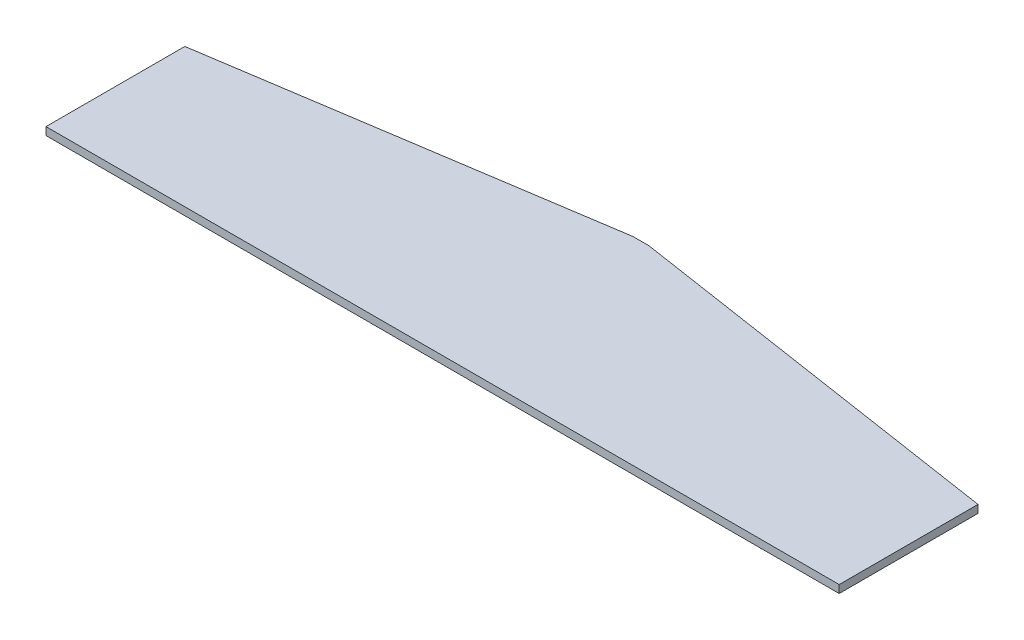
ISO-10303-21;
HEADER;
FILE_DESCRIPTION(('STEP AP214'),'2;1');
FILE_NAME('part.step','',(''),(''),'','','');
FILE_SCHEMA(('AUTOMOTIVE_DESIGN { 1 0 10303 214 1 1 1 1 }'));
ENDSEC;
DATA;
#1=APPLICATION_CONTEXT('core data for automotive mechanical design processes');
#2=APPLICATION_PROTOCOL_DEFINITION('international standard','automotive_design',2000,#1);
#3=PRODUCT_CONTEXT('',#1,'mechanical');
#4=PRODUCT('Part','Part','',(#3));
#5=PRODUCT_RELATED_PRODUCT_CATEGORY('part','',(#4));
#6=PRODUCT_DEFINITION_FORMATION('','',#4);
#7=PRODUCT_DEFINITION_CONTEXT('part definition',#1,'design');
#8=PRODUCT_DEFINITION('design','',#6,#7);
#9=PRODUCT_DEFINITION_SHAPE('','',#8);
#10=(LENGTH_UNIT() NAMED_UNIT(*) SI_UNIT(.MILLI.,.METRE.));
#11=(NAMED_UNIT(*) PLANE_ANGLE_UNIT() SI_UNIT($,.RADIAN.));
#12=(NAMED_UNIT(*) SI_UNIT($,.STERADIAN.) SOLID_ANGLE_UNIT());
#13=UNCERTAINTY_MEASURE_WITH_UNIT(LENGTH_MEASURE(1.E-05),#10,'distance_accuracy_value','');
#14=(GEOMETRIC_REPRESENTATION_CONTEXT(3) GLOBAL_UNCERTAINTY_ASSIGNED_CONTEXT((#13)) GLOBAL_UNIT_ASSIGNED_CONTEXT((#10,
#11,#12)) REPRESENTATION_CONTEXT('',''));
#15=CARTESIAN_POINT('',(0.,0.,0.));
#16=DIRECTION('',(0.,0.,1.));
#17=DIRECTION('',(1.,0.,0.));
#18=AXIS2_PLACEMENT_3D('',#15,#16,#17);
#19=CARTESIAN_POINT('',(-248.92,5.,38.1));
#20=DIRECTION('',(0.151299186009207,0.,0.988488015260151));
#21=DIRECTION('',(0.988488015260151,0.,-0.151299186009207));
#22=AXIS2_PLACEMENT_3D('',#19,#20,#21);
#23=PLANE('',#22);
#24=DIRECTION('',(-0.98848801526015,0.,0.151299186009207));
#25=VECTOR('',#24,1.);
#26=CARTESIAN_POINT('',(-248.92,0.,38.1));
#27=LINE('',#26,#25);
#28=CARTESIAN_POINT('',(0.,0.,0.));
#29=VERTEX_POINT('',#28);
#30=CARTESIAN_POINT('',(-248.92,0.,38.1));
#31=VERTEX_POINT('',#30);
#32=EDGE_CURVE('E128',#29,#31,#27,.T.);
#33=ORIENTED_EDGE('',*,*,#32,.T.);
#34=DIRECTION('',(0.,-1.,0.));
#35=VECTOR('',#34,1.);
#36=CARTESIAN_POINT('',(-248.92,5.,38.1));
#37=LINE('',#36,#35);
#38=CARTESIAN_POINT('',(-248.92,5.,38.1));
#39=VERTEX_POINT('',#38);
#40=EDGE_CURVE('E11',#39,#31,#37,.T.);
#41=ORIENTED_EDGE('',*,*,#40,.F.);
#42=DIRECTION('',(-0.98848801526015,0.,0.151299186009207));
#43=VECTOR('',#42,1.);
#44=CARTESIAN_POINT('',(-248.92,5.,38.1));
#45=LINE('',#44,#43);
#46=CARTESIAN_POINT('',(0.,5.,0.));
#47=VERTEX_POINT('',#46);
#48=EDGE_CURVE('E144',#47,#39,#45,.T.);
#49=ORIENTED_EDGE('',*,*,#48,.F.);
#50=DIRECTION('',(0.,-1.,0.));
#51=VECTOR('',#50,1.);
#52=CARTESIAN_POINT('',(0.,5.,0.));
#53=LINE('',#52,#51);
#54=EDGE_CURVE('E124',#47,#29,#53,.T.);
#55=ORIENTED_EDGE('',*,*,#54,.T.);
#56=EDGE_LOOP('',(#33,#41,#49,#55));
#57=FACE_BOUND('',#56,.T.);
#58=ADVANCED_FACE('F39',(#57),#23,.F.);
#59=CARTESIAN_POINT('',(-248.92,5.,127.));
#60=DIRECTION('',(1.,0.,0.));
#61=DIRECTION('',(0.,0.,-1.));
#62=AXIS2_PLACEMENT_3D('',#59,#60,#61);
#63=PLANE('',#62);
#64=DIRECTION('',(0.,0.,1.));
#65=VECTOR('',#64,1.);
#66=CARTESIAN_POINT('',(-248.92,0.,127.));
#67=LINE('',#66,#65);
#68=CARTESIAN_POINT('',(-248.92,0.,127.));
#69=VERTEX_POINT('',#68);
#70=EDGE_CURVE('E132',#31,#69,#67,.T.);
#71=ORIENTED_EDGE('',*,*,#70,.T.);
#72=DIRECTION('',(0.,-1.,0.));
#73=VECTOR('',#72,1.);
#74=CARTESIAN_POINT('',(-248.92,5.,127.));
#75=LINE('',#74,#73);
#76=CARTESIAN_POINT('',(-248.92,5.,127.));
#77=VERTEX_POINT('',#76);
#78=EDGE_CURVE('E48',#77,#69,#75,.T.);
#79=ORIENTED_EDGE('',*,*,#78,.F.);
#80=DIRECTION('',(0.,0.,1.));
#81=VECTOR('',#80,1.);
#82=CARTESIAN_POINT('',(-248.92,5.,127.));
#83=LINE('',#82,#81);
#84=EDGE_CURVE('E93',#39,#77,#83,.T.);
#85=ORIENTED_EDGE('',*,*,#84,.F.);
#86=ORIENTED_EDGE('',*,*,#40,.T.);
#87=EDGE_LOOP('',(#71,#79,#85,#86));
#88=FACE_BOUND('',#87,.T.);
#89=ADVANCED_FACE('F172',(#88),#63,.F.);
#90=CARTESIAN_POINT('',(259.08,5.,127.));
#91=DIRECTION('',(0.,0.,-1.));
#92=DIRECTION('',(-1.,0.,0.));
#93=AXIS2_PLACEMENT_3D('',#90,#91,#92);
#94=PLANE('',#93);
#95=DIRECTION('',(1.,0.,0.));
#96=VECTOR('',#95,1.);
#97=CARTESIAN_POINT('',(259.08,0.,127.));
#98=LINE('',#97,#96);
#99=CARTESIAN_POINT('',(259.08,0.,127.));
#100=VERTEX_POINT('',#99);
#101=EDGE_CURVE('E135',#69,#100,#98,.T.);
#102=ORIENTED_EDGE('',*,*,#101,.T.);
#103=DIRECTION('',(0.,-1.,0.));
#104=VECTOR('',#103,1.);
#105=CARTESIAN_POINT('',(259.08,5.,127.));
#106=LINE('',#105,#104);
#107=CARTESIAN_POINT('',(259.08,5.,127.));
#108=VERTEX_POINT('',#107);
#109=EDGE_CURVE('E117',#108,#100,#106,.T.);
#110=ORIENTED_EDGE('',*,*,#109,.F.);
#111=DIRECTION('',(1.,0.,0.));
#112=VECTOR('',#111,1.);
#113=CARTESIAN_POINT('',(259.08,5.,127.));
#114=LINE('',#113,#112);
#115=EDGE_CURVE('E106',#77,#108,#114,.T.);
#116=ORIENTED_EDGE('',*,*,#115,.F.);
#117=ORIENTED_EDGE('',*,*,#78,.T.);
#118=EDGE_LOOP('',(#102,#110,#116,#117));
#119=FACE_BOUND('',#118,.T.);
#120=ADVANCED_FACE('F154',(#119),#94,.F.);
#121=CARTESIAN_POINT('',(259.08,5.,38.1));
#122=DIRECTION('',(-1.,0.,0.));
#123=DIRECTION('',(0.,0.,1.));
#124=AXIS2_PLACEMENT_3D('',#121,#122,#123);
#125=PLANE('',#124);
#126=DIRECTION('',(0.,0.,-1.));
#127=VECTOR('',#126,1.);
#128=CARTESIAN_POINT('',(259.08,0.,38.1));
#129=LINE('',#128,#127);
#130=CARTESIAN_POINT('',(259.08,0.,38.1));
#131=VERTEX_POINT('',#130);
#132=EDGE_CURVE('E115',#100,#131,#129,.T.);
#133=ORIENTED_EDGE('',*,*,#132,.T.);
#134=DIRECTION('',(0.,-1.,0.));
#135=VECTOR('',#134,1.);
#136=CARTESIAN_POINT('',(259.08,5.,38.1));
#137=LINE('',#136,#135);
#138=CARTESIAN_POINT('',(259.08,5.,38.1));
#139=VERTEX_POINT('',#138);
#140=EDGE_CURVE('E112',#139,#131,#137,.T.);
#141=ORIENTED_EDGE('',*,*,#140,.F.);
#142=DIRECTION('',(0.,0.,-1.));
#143=VECTOR('',#142,1.);
#144=CARTESIAN_POINT('',(259.08,5.,38.1));
#145=LINE('',#144,#143);
#146=EDGE_CURVE('E100',#108,#139,#145,.T.);
#147=ORIENTED_EDGE('',*,*,#146,.F.);
#148=ORIENTED_EDGE('',*,*,#109,.T.);
#149=EDGE_LOOP('',(#133,#141,#147,#148));
#150=FACE_BOUND('',#149,.T.);
#151=ADVANCED_FACE('F113',(#150),#125,.F.);
#152=CARTESIAN_POINT('',(10.16,5.,0.));
#153=DIRECTION('',(-0.151299186009207,0.,0.988488015260151));
#154=DIRECTION('',(0.988488015260151,0.,0.151299186009207));
#155=AXIS2_PLACEMENT_3D('',#152,#153,#154);
#156=PLANE('',#155);
#157=DIRECTION('',(-0.988488015260151,0.,-0.151299186009207));
#158=VECTOR('',#157,1.);
#159=CARTESIAN_POINT('',(10.16,0.,0.));
#160=LINE('',#159,#158);
#161=CARTESIAN_POINT('',(10.16,0.,0.));
#162=VERTEX_POINT('',#161);
#163=EDGE_CURVE('E79',#131,#162,#160,.T.);
#164=ORIENTED_EDGE('',*,*,#163,.T.);
#165=DIRECTION('',(0.,-1.,0.));
#166=VECTOR('',#165,1.);
#167=CARTESIAN_POINT('',(10.16,5.,0.));
#168=LINE('',#167,#166);
#169=CARTESIAN_POINT('',(10.16,5.,0.));
#170=VERTEX_POINT('',#169);
#171=EDGE_CURVE('E118',#170,#162,#168,.T.);
#172=ORIENTED_EDGE('',*,*,#171,.F.);
#173=DIRECTION('',(-0.988488015260151,0.,-0.151299186009207));
#174=VECTOR('',#173,1.);
#175=CARTESIAN_POINT('',(10.16,5.,0.));
#176=LINE('',#175,#174);
#177=EDGE_CURVE('E104',#139,#170,#176,.T.);
#178=ORIENTED_EDGE('',*,*,#177,.F.);
#179=ORIENTED_EDGE('',*,*,#140,.T.);
#180=EDGE_LOOP('',(#164,#172,#178,#179));
#181=FACE_BOUND('',#180,.T.);
#182=ADVANCED_FACE('F120',(#181),#156,.F.);
#183=CARTESIAN_POINT('',(0.,5.,0.));
#184=DIRECTION('',(0.,0.,1.));
#185=DIRECTION('',(1.,0.,0.));
#186=AXIS2_PLACEMENT_3D('',#183,#184,#185);
#187=PLANE('',#186);
#188=DIRECTION('',(-1.,0.,0.));
#189=VECTOR('',#188,1.);
#190=CARTESIAN_POINT('',(0.,0.,0.));
#191=LINE('',#190,#189);
#192=EDGE_CURVE('E85',#162,#29,#191,.T.);
#193=ORIENTED_EDGE('',*,*,#192,.T.);
#194=ORIENTED_EDGE('',*,*,#54,.F.);
#195=DIRECTION('',(-1.,0.,0.));
#196=VECTOR('',#195,1.);
#197=CARTESIAN_POINT('',(0.,5.,0.));
#198=LINE('',#197,#196);
#199=EDGE_CURVE('E56',#170,#47,#198,.T.);
#200=ORIENTED_EDGE('',*,*,#199,.F.);
#201=ORIENTED_EDGE('',*,*,#171,.T.);
#202=EDGE_LOOP('',(#193,#194,#200,#201));
#203=FACE_BOUND('',#202,.T.);
#204=ADVANCED_FACE('F161',(#203),#187,.F.);
#205=CARTESIAN_POINT('',(0.,5.,0.));
#206=DIRECTION('',(0.,-1.,0.));
#207=DIRECTION('',(0.,0.,-1.));
#208=AXIS2_PLACEMENT_3D('',#205,#206,#207);
#209=PLANE('',#208);
#210=ORIENTED_EDGE('',*,*,#48,.T.);
#211=ORIENTED_EDGE('',*,*,#84,.T.);
#212=ORIENTED_EDGE('',*,*,#115,.T.);
#213=ORIENTED_EDGE('',*,*,#146,.T.);
#214=ORIENTED_EDGE('',*,*,#177,.T.);
#215=ORIENTED_EDGE('',*,*,#199,.T.);
#216=EDGE_LOOP('',(#210,#211,#212,#213,#214,#215));
#217=FACE_BOUND('',#216,.T.);
#218=ADVANCED_FACE('F102',(#217),#209,.F.);
#219=CARTESIAN_POINT('',(0.,0.,0.));
#220=DIRECTION('',(0.,-1.,0.));
#221=DIRECTION('',(0.,0.,-1.));
#222=AXIS2_PLACEMENT_3D('',#219,#220,#221);
#223=PLANE('',#222);
#224=ORIENTED_EDGE('',*,*,#32,.F.);
#225=ORIENTED_EDGE('',*,*,#192,.F.);
#226=ORIENTED_EDGE('',*,*,#163,.F.);
#227=ORIENTED_EDGE('',*,*,#132,.F.);
#228=ORIENTED_EDGE('',*,*,#101,.F.);
#229=ORIENTED_EDGE('',*,*,#70,.F.);
#230=EDGE_LOOP('',(#224,#225,#226,#227,#228,#229));
#231=FACE_BOUND('',#230,.T.);
#232=ADVANCED_FACE('F157',(#231),#223,.T.);
#233=CLOSED_SHELL('',(#58,#89,#120,#151,#182,#204,#218,#232));
#234=MANIFOLD_SOLID_BREP('B2',#233);
#235=ADVANCED_BREP_SHAPE_REPRESENTATION('',(#18,#234),#14);
#236=SHAPE_DEFINITION_REPRESENTATION(#9,#235);
ENDSEC;
END-ISO-10303-21;
